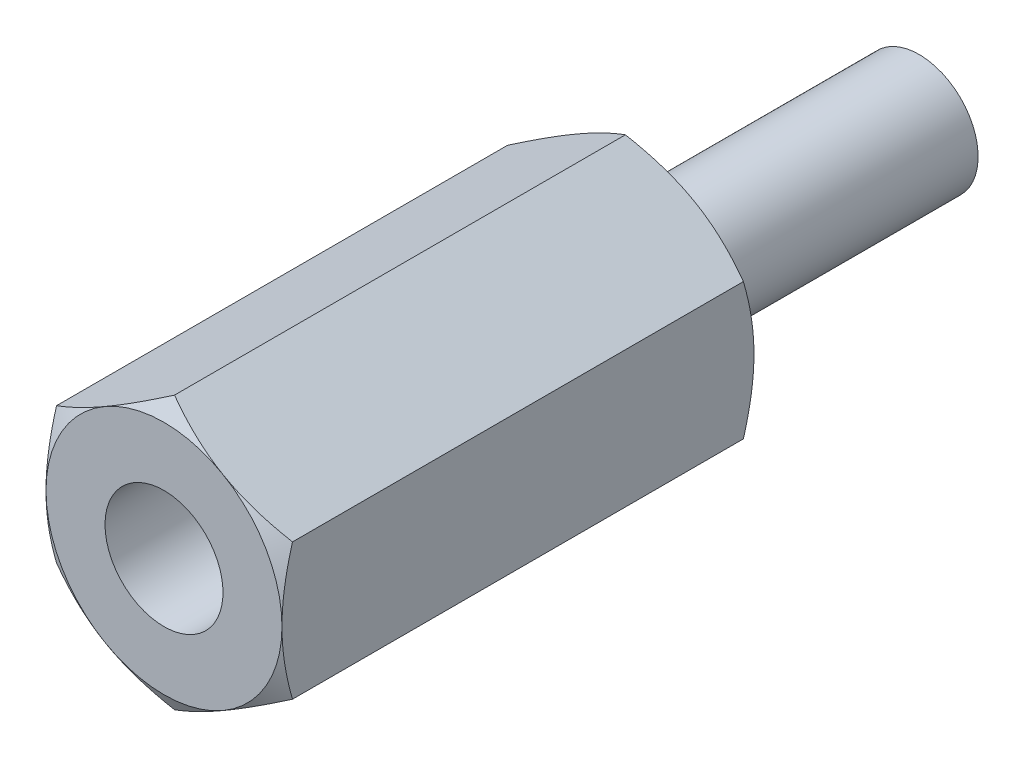
ISO-10303-21;
HEADER;
FILE_DESCRIPTION(('STEP AP214'),'2;1');
FILE_NAME('part.step','',(''),(''),'','','');
FILE_SCHEMA(('AUTOMOTIVE_DESIGN { 1 0 10303 214 1 1 1 1 }'));
ENDSEC;
DATA;
#1=APPLICATION_CONTEXT('core data for automotive mechanical design processes');
#2=APPLICATION_PROTOCOL_DEFINITION('international standard','automotive_design',2000,#1);
#3=PRODUCT_CONTEXT('',#1,'mechanical');
#4=PRODUCT('Part','Part','',(#3));
#5=PRODUCT_RELATED_PRODUCT_CATEGORY('part','',(#4));
#6=PRODUCT_DEFINITION_FORMATION('','',#4);
#7=PRODUCT_DEFINITION_CONTEXT('part definition',#1,'design');
#8=PRODUCT_DEFINITION('design','',#6,#7);
#9=PRODUCT_DEFINITION_SHAPE('','',#8);
#10=(LENGTH_UNIT() NAMED_UNIT(*) SI_UNIT(.MILLI.,.METRE.));
#11=(NAMED_UNIT(*) PLANE_ANGLE_UNIT() SI_UNIT($,.RADIAN.));
#12=(NAMED_UNIT(*) SI_UNIT($,.STERADIAN.) SOLID_ANGLE_UNIT());
#13=UNCERTAINTY_MEASURE_WITH_UNIT(LENGTH_MEASURE(1.E-05),#10,'distance_accuracy_value','');
#14=(GEOMETRIC_REPRESENTATION_CONTEXT(3) GLOBAL_UNCERTAINTY_ASSIGNED_CONTEXT((#13)) GLOBAL_UNIT_ASSIGNED_CONTEXT((#10,
#11,#12)) REPRESENTATION_CONTEXT('',''));
#15=CARTESIAN_POINT('',(0.,0.,0.));
#16=DIRECTION('',(0.,0.,1.));
#17=DIRECTION('',(1.,0.,0.));
#18=AXIS2_PLACEMENT_3D('',#15,#16,#17);
#19=CARTESIAN_POINT('',(0.,0.,-4.77536926035782));
#20=DIRECTION('',(0.,0.,1.));
#21=DIRECTION('',(1.,0.,0.));
#22=AXIS2_PLACEMENT_3D('',#19,#20,#21);
#23=CONICAL_SURFACE('',#22,2.88907185398557,1.04719755117262);
#24=CARTESIAN_POINT('',(-7.08110458969458E-08,2.88675134353334,-4.77670896439458));
#25=CARTESIAN_POINT('',(0.101767141185275,2.82799604409952,-4.81063129042307));
#26=CARTESIAN_POINT('',(0.204322575283856,2.76878564797065,-4.84171386801845));
#27=CARTESIAN_POINT('',(0.410337667627594,2.64984278719961,-4.89652772623953));
#28=CARTESIAN_POINT('',(0.51379013883194,2.59011447207015,-4.92029535741371));
#29=CARTESIAN_POINT('',(0.722074540919704,2.46986141428833,-4.95920267065775));
#30=CARTESIAN_POINT('',(0.826907880543953,2.40933585830341,-4.97433270862273));
#31=CARTESIAN_POINT('',(0.984944191016707,2.31809355223726,-4.98964323938749));
#32=CARTESIAN_POINT('',(1.03789142562392,2.28752445202925,-4.99351636188467));
#33=CARTESIAN_POINT('',(1.14389002708072,2.22632613083503,-4.99869890228769));
#34=CARTESIAN_POINT('',(1.19694141247179,2.1956968991439,-5.0000078124577));
#35=CARTESIAN_POINT('',(1.25,2.16506350946109,-5.00000000000294));
#36=B_SPLINE_CURVE_WITH_KNOTS('',3,(#24,#25,#26,#27,#28,#29,#30,#31,#32,#33,#34,#35),
.UNSPECIFIED.,.F.,.F.,(4,2,2,2,2,4),(0.,0.367018347334865,0.732182251596257,1.09775307775673,
1.28148755337713,1.46525840630775),.UNSPECIFIED.);
#37=CARTESIAN_POINT('',(-4.305442959148E-08,2.88675132109064,-4.77670902064944));
#38=VERTEX_POINT('',#37);
#39=CARTESIAN_POINT('',(1.24999999999943,2.16506350946011,-5.00000000000359));
#40=VERTEX_POINT('',#39);
#41=EDGE_CURVE('P0_E129',#38,#40,#36,.T.);
#42=ORIENTED_EDGE('',*,*,#41,.T.);
#43=CARTESIAN_POINT('',(0.,0.,-5.00000000000425));
#44=DIRECTION('',(0.,0.,1.));
#45=DIRECTION('',(1.,0.,0.));
#46=AXIS2_PLACEMENT_3D('',#43,#44,#45);
#47=CIRCLE('',#46,2.49999999999773);
#48=CARTESIAN_POINT('',(-1.24999999999943,2.16506350946011,-5.00000000000359));
#49=VERTEX_POINT('',#48);
#50=EDGE_CURVE('P0_E119',#49,#40,#47,.F.);
#51=ORIENTED_EDGE('',*,*,#50,.F.);
#52=CARTESIAN_POINT('',(-1.25,2.1650635094611,-5.00000000000293));
#53=CARTESIAN_POINT('',(-1.19694141878281,2.19569689560966,-5.00000781251171));
#54=CARTESIAN_POINT('',(-1.14389003964854,2.22632612363371,-4.99869890262452));
#55=CARTESIAN_POINT('',(-1.03789145062155,2.28752443754217,-4.99351636338333));
#56=CARTESIAN_POINT('',(-0.984944222187435,2.31809353413145,-4.9896432417626));
#57=CARTESIAN_POINT('',(-0.826907929954011,2.40933582999415,-4.97433271468945));
#58=CARTESIAN_POINT('',(-0.722074602461731,2.46986137984186,-4.95920268060034));
#59=CARTESIAN_POINT('',(-0.513790223309086,2.59011442221363,-4.92029537475209));
#60=CARTESIAN_POINT('',(-0.410337762906129,2.64984272807561,-4.89652774712257));
#61=CARTESIAN_POINT('',(-0.204322696634617,2.76878558204458,-4.84171390479733));
#62=CARTESIAN_POINT('',(-0.101767277824047,2.82799598070172,-4.81063133961675));
#63=CARTESIAN_POINT('',(-8.61088561993545E-08,2.88675129623316,-4.77670903500092));
#64=B_SPLINE_CURVE_WITH_KNOTS('',3,(#52,#53,#54,#55,#56,#57,#58,#59,#60,#61,#62,#63),
.UNSPECIFIED.,.F.,.F.,(4,2,2,2,2,4),(0.,0.183770831198168,0.367505285262938,0.733076069510794,
1.09823993088061,1.46525823411971),.UNSPECIFIED.);
#65=EDGE_CURVE('P0_E21',#49,#38,#64,.T.);
#66=ORIENTED_EDGE('',*,*,#65,.T.);
#67=EDGE_LOOP('',(#42,#51,#66));
#68=FACE_BOUND('',#67,.T.);
#69=ADVANCED_FACE('P0_F17',(#68),#23,.T.);
#70=CARTESIAN_POINT('',(0.,0.,-4.77536926035782));
#71=DIRECTION('',(0.,0.,1.));
#72=DIRECTION('',(1.,0.,0.));
#73=AXIS2_PLACEMENT_3D('',#70,#71,#72);
#74=CONICAL_SURFACE('',#73,2.88907185398557,1.04719755117262);
#75=CARTESIAN_POINT('',(0.,0.,-5.00000000000425));
#76=DIRECTION('',(0.,0.,1.));
#77=DIRECTION('',(1.,0.,0.));
#78=AXIS2_PLACEMENT_3D('',#75,#76,#77);
#79=CIRCLE('',#78,2.49999999999773);
#80=CARTESIAN_POINT('',(2.49999999999886,0.,-5.00000000000359));
#81=VERTEX_POINT('',#80);
#82=EDGE_CURVE('P0_E141',#40,#81,#79,.F.);
#83=ORIENTED_EDGE('',*,*,#82,.F.);
#84=CARTESIAN_POINT('',(1.25,2.16506350946109,-5.00000000000294));
#85=CARTESIAN_POINT('',(1.30305858726613,2.13443011982017,-5.00000781251527));
#86=CARTESIAN_POINT('',(1.35610997244676,2.10380088830525,-4.99869890232771));
#87=CARTESIAN_POINT('',(1.46210857352899,2.0426025674367,-4.99351636190913));
#88=CARTESIAN_POINT('',(1.515055807972,2.01203346737819,-4.98964323941175));
#89=CARTESIAN_POINT('',(1.67309211799855,1.92079116124262,-4.97433270891051));
#90=CARTESIAN_POINT('',(1.77792545718978,1.86026560464052,-4.95920267147099));
#91=CARTESIAN_POINT('',(1.98620985931024,1.74001254900827,-4.92029535730132));
#92=CARTESIAN_POINT('',(2.08966233098298,1.68028423663968,-4.896527724706));
#93=CARTESIAN_POINT('',(2.29567741958501,1.56134136977817,-4.8417138712966));
#94=CARTESIAN_POINT('',(2.3982328494534,1.5021309647368,-4.81063129998625));
#95=CARTESIAN_POINT('',(2.50000005206237,1.44337564291584,-4.77670898894384));
#96=B_SPLINE_CURVE_WITH_KNOTS('',3,(#84,#85,#86,#87,#88,#89,#90,#91,#92,#93,#94,#95),
.UNSPECIFIED.,.F.,.F.,(4,2,2,2,2,4),(0.,0.183770852142172,0.367505327130569,0.733076152714915,
1.09824005523158,1.46525840012142),.UNSPECIFIED.);
#97=CARTESIAN_POINT('',(2.50000002886377,1.44337565630955,-4.77670899667671));
#98=VERTEX_POINT('',#97);
#99=EDGE_CURVE('P0_E320',#40,#98,#96,.T.);
#100=ORIENTED_EDGE('',*,*,#99,.T.);
#101=CARTESIAN_POINT('',(2.5,1.44337557354446,-4.77670903500082));
#102=CARTESIAN_POINT('',(2.5,1.32586494248156,-4.81063133961667));
#103=CARTESIAN_POINT('',(2.5,1.20744414516726,-4.84171390479726));
#104=CARTESIAN_POINT('',(2.5,0.969558437229248,-4.89652774712252));
#105=CARTESIAN_POINT('',(2.5,0.850101825505269,-4.92029537475205));
#106=CARTESIAN_POINT('',(2.5,0.609595740761665,-4.95920268060032));
#107=CARTESIAN_POINT('',(2.5,0.488544641066212,-4.97433271468944));
#108=CARTESIAN_POINT('',(2.5,0.306060049340773,-4.9896432417626));
#109=CARTESIAN_POINT('',(2.5,0.244921856162199,-4.99351636338332));
#110=CARTESIAN_POINT('',(2.5,0.122525228345262,-4.99869890262452));
#111=CARTESIAN_POINT('',(2.5,0.0612667722971475,-5.00000781251171));
#112=CARTESIAN_POINT('',(2.5,0.,-5.00000000000293));
#113=B_SPLINE_CURVE_WITH_KNOTS('',3,(#101,#102,#103,#104,#105,#106,#107,#108,#109,#110,#111,
#112),.UNSPECIFIED.,.F.,.F.,(4,2,2,2,2,4),(0.,0.367018303239194,0.732182164609092,
1.09775294885704,1.28148740292185,1.46525823412006),.UNSPECIFIED.);
#114=EDGE_CURVE('P0_E326',#98,#81,#113,.T.);
#115=ORIENTED_EDGE('',*,*,#114,.T.);
#116=EDGE_LOOP('',(#83,#100,#115));
#117=FACE_BOUND('',#116,.T.);
#118=ADVANCED_FACE('P0_F312',(#117),#74,.T.);
#119=CARTESIAN_POINT('',(0.,0.,-4.77536926035782));
#120=DIRECTION('',(0.,0.,1.));
#121=DIRECTION('',(1.,0.,0.));
#122=AXIS2_PLACEMENT_3D('',#119,#120,#121);
#123=CONICAL_SURFACE('',#122,2.88907185398557,1.04719755117262);
#124=CARTESIAN_POINT('',(0.,0.,-5.00000000000425));
#125=DIRECTION('',(0.,0.,1.));
#126=DIRECTION('',(1.,0.,0.));
#127=AXIS2_PLACEMENT_3D('',#124,#125,#126);
#128=CIRCLE('',#127,2.49999999999773);
#129=CARTESIAN_POINT('',(1.24999999999943,-2.16506350946011,-5.00000000000359));
#130=VERTEX_POINT('',#129);
#131=EDGE_CURVE('P0_E143',#81,#130,#128,.F.);
#132=ORIENTED_EDGE('',*,*,#131,.F.);
#133=CARTESIAN_POINT('',(2.5,0.,-5.00000000000293));
#134=CARTESIAN_POINT('',(2.5,-0.0612667792805873,-5.00000781251526));
#135=CARTESIAN_POINT('',(2.5,-0.122525242309175,-4.99869890232776));
#136=CARTESIAN_POINT('',(2.5,-0.244921884043781,-4.9935163619094));
#137=CARTESIAN_POINT('',(2.5,-0.306060084159568,-4.98964323941217));
#138=CARTESIAN_POINT('',(2.5,-0.488544696427004,-4.97433270891154));
#139=CARTESIAN_POINT('',(2.5,-0.60959580962879,-4.95920267147263));
#140=CARTESIAN_POINT('',(2.5,-0.850101920888531,-4.92029535730445));
#141=CARTESIAN_POINT('',(2.5,-0.969558545623372,-4.89652772471002));
#142=CARTESIAN_POINT('',(2.5,-1.20744427934176,-4.84171387130261));
#143=CARTESIAN_POINT('',(2.5,-1.3258650894222,-4.81063129999337));
#144=CARTESIAN_POINT('',(2.5,-1.44337573306188,-4.77670898895211));
#145=B_SPLINE_CURVE_WITH_KNOTS('',3,(#133,#134,#135,#136,#137,#138,#139,#140,#141,#142,#143,
#144),.UNSPECIFIED.,.F.,.F.,(4,2,2,2,2,4),(0.,0.183770852138413,0.367505327123055,
0.733076152699981,1.09824005520926,1.46525840009163),.UNSPECIFIED.);
#146=CARTESIAN_POINT('',(2.5,-1.44337570629047,-4.77670899668035));
#147=VERTEX_POINT('',#146);
#148=EDGE_CURVE('P0_E289',#81,#147,#145,.T.);
#149=ORIENTED_EDGE('',*,*,#148,.T.);
#150=CARTESIAN_POINT('',(2.49999991386643,-1.44337572270331,-4.77670903500916));
#151=CARTESIAN_POINT('',(2.39823272215319,-1.50213103823362,-4.81063133962384));
#152=CARTESIAN_POINT('',(2.29567730334459,-1.56134143688962,-4.84171390480332));
#153=CARTESIAN_POINT('',(2.08966223707707,-1.68028429085629,-4.89652774712658));
#154=CARTESIAN_POINT('',(1.98620977667613,-1.7400125967171,-4.92029537475521));
#155=CARTESIAN_POINT('',(1.7779253975276,-1.8602656390865,-4.95920268060197));
#156=CARTESIAN_POINT('',(1.67309207003741,-1.920791188933,-4.97433271469048));
#157=CARTESIAN_POINT('',(1.51505577780717,-2.01203348479386,-4.98964324176302));
#158=CARTESIAN_POINT('',(1.46210854937413,-2.04260258138252,-4.99351636338359));
#159=CARTESIAN_POINT('',(1.3561099603493,-2.10380089528973,-4.99869890262458));
#160=CARTESIAN_POINT('',(1.30305858121611,-2.13443012331316,-5.00000781251171));
#161=CARTESIAN_POINT('',(1.25,-2.1650635094611,-5.00000000000293));
#162=B_SPLINE_CURVE_WITH_KNOTS('',3,(#150,#151,#152,#153,#154,#155,#156,#157,#158,#159,#160,
#161),.UNSPECIFIED.,.F.,.F.,(4,2,2,2,2,4),(0.,0.367018303231656,0.732182164594107,
1.09775294883457,1.2814874028956,1.46525823409002),.UNSPECIFIED.);
#163=EDGE_CURVE('P0_E281',#147,#130,#162,.T.);
#164=ORIENTED_EDGE('',*,*,#163,.T.);
#165=EDGE_LOOP('',(#132,#149,#164));
#166=FACE_BOUND('',#165,.T.);
#167=ADVANCED_FACE('P0_F308',(#166),#123,.T.);
#168=CARTESIAN_POINT('',(0.,0.,-4.77536926035782));
#169=DIRECTION('',(0.,0.,1.));
#170=DIRECTION('',(1.,0.,0.));
#171=AXIS2_PLACEMENT_3D('',#168,#169,#170);
#172=CONICAL_SURFACE('',#171,2.88907185398557,1.04719755117262);
#173=CARTESIAN_POINT('',(0.,0.,-5.00000000000425));
#174=DIRECTION('',(0.,0.,1.));
#175=DIRECTION('',(1.,0.,0.));
#176=AXIS2_PLACEMENT_3D('',#173,#174,#175);
#177=CIRCLE('',#176,2.49999999999773);
#178=CARTESIAN_POINT('',(-1.24999999999943,-2.16506350946011,-5.00000000000359));
#179=VERTEX_POINT('',#178);
#180=EDGE_CURVE('P0_E139',#130,#179,#177,.F.);
#181=ORIENTED_EDGE('',*,*,#180,.F.);
#182=CARTESIAN_POINT('',(1.25,-2.1650635094611,-5.00000000000293));
#183=CARTESIAN_POINT('',(1.19694141273445,-2.19569689910168,-5.00000781251526));
#184=CARTESIAN_POINT('',(1.1438900275544,-2.22632613061627,-4.99869890232773));
#185=CARTESIAN_POINT('',(1.03789142647331,-2.28752445148416,-4.99351636190927));
#186=CARTESIAN_POINT('',(0.984944192030882,-2.31809355154234,-4.98964323941197));
#187=CARTESIAN_POINT('',(0.826907882006037,-2.40933585767692,-4.97433270891106));
#188=CARTESIAN_POINT('',(0.722074542815924,-2.46986141427838,-4.95920267147186));
#189=CARTESIAN_POINT('',(0.513790140697656,-2.59011446990936,-4.92029535730298));
#190=CARTESIAN_POINT('',(0.410337669025995,-2.64984278227733,-4.89652772470814));
#191=CARTESIAN_POINT('',(0.204322580426101,-2.7687856491376,-4.8417138712998));
#192=CARTESIAN_POINT('',(0.101767150558775,-2.82799605417836,-4.81063129999004));
#193=CARTESIAN_POINT('',(-5.2049158781085E-08,-2.88675137599873,-4.77670898894825));
#194=B_SPLINE_CURVE_WITH_KNOTS('',3,(#182,#183,#184,#185,#186,#187,#188,#189,#190,#191,#192,
#193),.UNSPECIFIED.,.F.,.F.,(4,2,2,2,2,4),(0.,0.183770852140169,0.367505327126564,
0.733076152706955,1.09824005521969,1.46525840010554),.UNSPECIFIED.);
#195=CARTESIAN_POINT('',(-2.88578851821517E-08,-2.88675136260924,-4.77670899667867));
#196=VERTEX_POINT('',#195);
#197=EDGE_CURVE('P0_E279',#130,#196,#194,.T.);
#198=ORIENTED_EDGE('',*,*,#197,.T.);
#199=CARTESIAN_POINT('',(-8.61202042122576E-08,-2.8867512962266,-4.7767090350047));
#200=CARTESIAN_POINT('',(-0.1017672778345,-2.82799598069568,-4.81063133962001));
#201=CARTESIAN_POINT('',(-0.204322696644161,-2.76878558203907,-4.84171390480008));
#202=CARTESIAN_POINT('',(-0.41033776291384,-2.64984272807115,-4.89652774712441));
#203=CARTESIAN_POINT('',(-0.51379022331587,-2.59011442220971,-4.92029537475353));
#204=CARTESIAN_POINT('',(-0.722074602466628,-2.46986137983902,-4.95920268060109));
#205=CARTESIAN_POINT('',(-0.826907929957947,-2.40933582999187,-4.97433271468993));
#206=CARTESIAN_POINT('',(-0.98494422218991,-2.31809353413001,-4.9896432417628));
#207=CARTESIAN_POINT('',(-1.03789145062353,-2.28752443754102,-4.99351636338345));
#208=CARTESIAN_POINT('',(-1.14389003964953,-2.22632612363314,-4.99869890262455));
#209=CARTESIAN_POINT('',(-1.1969414187833,-2.19569689560937,-5.00000781251171));
#210=CARTESIAN_POINT('',(-1.25,-2.16506350946109,-5.00000000000294));
#211=B_SPLINE_CURVE_WITH_KNOTS('',3,(#199,#200,#201,#202,#203,#204,#205,#206,#207,#208,#209,
#210),.UNSPECIFIED.,.F.,.F.,(4,2,2,2,2,4),(0.,0.367018303235684,0.732182164602115,
1.09775294884658,1.28148740290963,1.46525823410607),.UNSPECIFIED.);
#212=EDGE_CURVE('P0_E286',#196,#179,#211,.T.);
#213=ORIENTED_EDGE('',*,*,#212,.T.);
#214=EDGE_LOOP('',(#181,#198,#213));
#215=FACE_BOUND('',#214,.T.);
#216=ADVANCED_FACE('P0_F287',(#215),#172,.T.);
#217=CARTESIAN_POINT('',(0.,0.,-4.77536926035782));
#218=DIRECTION('',(0.,0.,1.));
#219=DIRECTION('',(1.,0.,0.));
#220=AXIS2_PLACEMENT_3D('',#217,#218,#219);
#221=CONICAL_SURFACE('',#220,2.88907185398557,1.04719755117262);
#222=CARTESIAN_POINT('',(-2.50000003330063,1.44337561043705,-4.77670896438965));
#223=CARTESIAN_POINT('',(-2.39823284539096,1.50213095158687,-4.81063129042238));
#224=CARTESIAN_POINT('',(-2.29567742112828,1.56134136475008,-4.84171386801935));
#225=CARTESIAN_POINT('',(-2.08966233593221,1.68028423789843,-4.89652772624128));
#226=CARTESIAN_POINT('',(-1.98620986210266,1.74001254848003,-4.92029535741474));
#227=CARTESIAN_POINT('',(-1.7779254581377,1.86026560300807,-4.95920267065802));
#228=CARTESIAN_POINT('',(-1.67309211926522,1.9207911602936,-4.97433270862297));
#229=CARTESIAN_POINT('',(-1.51505580907665,2.01203346684984,-4.98964323938761));
#230=CARTESIAN_POINT('',(-1.46210857442235,2.04260256697564,-4.99351636188475));
#231=CARTESIAN_POINT('',(-1.35610997287134,2.1038008880054,-4.99869890228769));
#232=CARTESIAN_POINT('',(-1.30305858743315,2.13443011961429,-5.00000781245768));
#233=CARTESIAN_POINT('',(-1.25,2.1650635094611,-5.00000000000293));
#234=B_SPLINE_CURVE_WITH_KNOTS('',3,(#222,#223,#224,#225,#226,#227,#228,#229,#230,#231,#232,
#233),.UNSPECIFIED.,.F.,.F.,(4,2,2,2,2,4),(0.,0.367018347333249,0.732182251592837,
1.09775307775113,1.28148755337054,1.46525840630021),.UNSPECIFIED.);
#235=CARTESIAN_POINT('',(-2.5,1.4433756232491,-4.77670902065233));
#236=VERTEX_POINT('',#235);
#237=EDGE_CURVE('P0_E109',#236,#49,#234,.T.);
#238=ORIENTED_EDGE('',*,*,#237,.T.);
#239=CARTESIAN_POINT('',(0.,0.,-5.00000000000425));
#240=DIRECTION('',(0.,0.,1.));
#241=DIRECTION('',(1.,0.,0.));
#242=AXIS2_PLACEMENT_3D('',#239,#240,#241);
#243=CIRCLE('',#242,2.49999999999773);
#244=CARTESIAN_POINT('',(-2.49999999999886,0.,-5.00000000000359));
#245=VERTEX_POINT('',#244);
#246=EDGE_CURVE('P0_E113',#245,#49,#243,.F.);
#247=ORIENTED_EDGE('',*,*,#246,.F.);
#248=CARTESIAN_POINT('',(-2.5,0.,-5.00000000000293));
#249=CARTESIAN_POINT('',(-2.5,0.061266772296258,-5.00000781251171));
#250=CARTESIAN_POINT('',(-2.5,0.122525228343483,-4.99869890262456));
#251=CARTESIAN_POINT('',(-2.5,0.244921856158648,-4.99351636338351));
#252=CARTESIAN_POINT('',(-2.5,0.306060049336338,-4.9896432417629));
#253=CARTESIAN_POINT('',(-2.5,0.48854464105916,-4.97433271469017));
#254=CARTESIAN_POINT('',(-2.5,0.609595740752892,-4.95920268060148));
#255=CARTESIAN_POINT('',(-2.5,0.850101825493118,-4.92029537475428));
#256=CARTESIAN_POINT('',(-2.5,0.96955843721544,-4.89652774712538));
#257=CARTESIAN_POINT('',(-2.5,1.20744414515016,-4.84171390480152));
#258=CARTESIAN_POINT('',(-2.5,1.32586494246284,-4.81063133962172));
#259=CARTESIAN_POINT('',(-2.5,1.44337557352414,-4.77670903500669));
#260=B_SPLINE_CURVE_WITH_KNOTS('',3,(#248,#249,#250,#251,#252,#253,#254,#255,#256,#257,#258,
#259),.UNSPECIFIED.,.F.,.F.,(4,2,2,2,2,4),(0.,0.183770831195545,0.367505285257694,
0.733076069500374,1.09823993086503,1.46525823409892),.UNSPECIFIED.);
#261=EDGE_CURVE('P0_E115',#245,#236,#260,.T.);
#262=ORIENTED_EDGE('',*,*,#261,.T.);
#263=EDGE_LOOP('',(#238,#247,#262));
#264=FACE_BOUND('',#263,.T.);
#265=ADVANCED_FACE('P0_F111',(#264),#221,.T.);
#266=CARTESIAN_POINT('',(0.,0.,-5.));
#267=DIRECTION('',(0.,0.,-1.));
#268=DIRECTION('',(-1.,0.,0.));
#269=AXIS2_PLACEMENT_3D('',#266,#267,#268);
#270=PLANE('',#269);
#271=CARTESIAN_POINT('',(0.,0.,-5.00000000000425));
#272=DIRECTION('',(0.,0.,1.));
#273=DIRECTION('',(1.,0.,0.));
#274=AXIS2_PLACEMENT_3D('',#271,#272,#273);
#275=CIRCLE('',#274,2.49999999999773);
#276=EDGE_CURVE('P0_E137',#245,#179,#275,.T.);
#277=ORIENTED_EDGE('',*,*,#276,.F.);
#278=ORIENTED_EDGE('',*,*,#246,.T.);
#279=ORIENTED_EDGE('',*,*,#50,.T.);
#280=ORIENTED_EDGE('',*,*,#82,.T.);
#281=ORIENTED_EDGE('',*,*,#131,.T.);
#282=ORIENTED_EDGE('',*,*,#180,.T.);
#283=EDGE_LOOP('',(#277,#278,#279,#280,#281,#282));
#284=FACE_BOUND('',#283,.T.);
#285=ADVANCED_FACE('P0_F132',(#284),#270,.T.);
#286=CARTESIAN_POINT('',(0.,0.,-4.77536926035782));
#287=DIRECTION('',(0.,0.,1.));
#288=DIRECTION('',(1.,0.,0.));
#289=AXIS2_PLACEMENT_3D('',#286,#287,#288);
#290=CONICAL_SURFACE('',#289,2.88907185398557,1.04719755117262);
#291=CARTESIAN_POINT('',(-2.5,0.,-5.00000000000293));
#292=CARTESIAN_POINT('',(-2.5,-0.0612667766499199,-5.00000781251393));
#293=CARTESIAN_POINT('',(-2.5,-0.122525237048958,-4.99869890243955));
#294=CARTESIAN_POINT('',(-2.5,-0.244921873540768,-4.99351636246463));
#295=CARTESIAN_POINT('',(-2.5,-0.306060071043301,-4.98964324029758));
#296=CARTESIAN_POINT('',(-2.5,-0.488544675572551,-4.97433271108808));
#297=CARTESIAN_POINT('',(-2.5,-0.609595783686492,-4.95920267491104));
#298=CARTESIAN_POINT('',(-2.5,-0.850101884957583,-4.92029536387697));
#299=CARTESIAN_POINT('',(-2.5,-0.969558504791223,-4.89652773315283));
#300=CARTESIAN_POINT('',(-2.5,-1.20744422879812,-4.84171388392007));
#301=CARTESIAN_POINT('',(-2.5,-1.32586503406955,-4.81063131491949));
#302=CARTESIAN_POINT('',(-2.5,-1.44337567297155,-4.77670900629869));
#303=B_SPLINE_CURVE_WITH_KNOTS('',3,(#291,#292,#293,#294,#295,#296,#297,#298,#299,#300,#301,
#302),.UNSPECIFIED.,.F.,.F.,(4,2,2,2,2,4),(0.,0.183770844250223,0.36750531135435,
0.733076121362618,1.09824000837466,1.46525833757001),.UNSPECIFIED.);
#304=CARTESIAN_POINT('',(-2.49999999999891,-1.44337567297343,-4.77670900629869));
#305=VERTEX_POINT('',#304);
#306=EDGE_CURVE('P0_E236',#245,#305,#303,.T.);
#307=ORIENTED_EDGE('',*,*,#306,.F.);
#308=ORIENTED_EDGE('',*,*,#276,.T.);
#309=CARTESIAN_POINT('',(-2.49999999999782,-1.44337567297532,-4.77670900629869));
#310=CARTESIAN_POINT('',(-2.39823280149375,-1.50213099242631,-4.81063131491949));
#311=CARTESIAN_POINT('',(-2.29567737579209,-1.56134139506203,-4.84171388392007));
#312=CARTESIAN_POINT('',(-2.08966229560446,-1.68028425706548,-4.89652773315283));
#313=CARTESIAN_POINT('',(-1.98620982817831,-1.7400125669823,-4.92029536387698));
#314=CARTESIAN_POINT('',(-1.77792543471239,-1.86026561761785,-4.95920267491104));
#315=CARTESIAN_POINT('',(-1.67309209992946,-1.92079117167482,-4.97433271108808));
#316=CARTESIAN_POINT('',(-1.51505579660757,-2.01203347393944,-4.98964324029758));
#317=CARTESIAN_POINT('',(-1.46210856442878,-2.04260257269071,-4.99351636246463));
#318=CARTESIAN_POINT('',(-1.35610996788911,-2.10380089093661,-4.99869890243955));
#319=CARTESIAN_POINT('',(-1.30305858498682,-2.13443012113613,-5.00000781251393));
#320=CARTESIAN_POINT('',(-1.25,-2.16506350946109,-5.00000000000294));
#321=B_SPLINE_CURVE_WITH_KNOTS('',3,(#309,#310,#311,#312,#313,#314,#315,#316,#317,#318,#319,
#320),.UNSPECIFIED.,.F.,.F.,(4,2,2,2,2,4),(0.,0.367018329195354,0.732182216207401,
1.09775302621567,1.2814874933198,1.46525833757002),.UNSPECIFIED.);
#322=EDGE_CURVE('P0_E256',#305,#179,#321,.T.);
#323=ORIENTED_EDGE('',*,*,#322,.F.);
#324=EDGE_LOOP('',(#307,#308,#323));
#325=FACE_BOUND('',#324,.T.);
#326=ADVANCED_FACE('P0_F250',(#325),#290,.T.);
#327=CARTESIAN_POINT('',(-2.5,-1.44337567297406,0.));
#328=DIRECTION('',(-0.5,-0.866025403784439,0.));
#329=DIRECTION('',(0.866025403784439,-0.5,0.));
#330=AXIS2_PLACEMENT_3D('',#327,#328,#329);
#331=PLANE('',#330);
#332=CARTESIAN_POINT('',(-1.25,-2.16506350946109,5.00000000000294));
#333=CARTESIAN_POINT('',(-1.30305858498681,-2.13443012113613,5.00000781251393));
#334=CARTESIAN_POINT('',(-1.3561099678891,-2.10380089093661,4.99869890243955));
#335=CARTESIAN_POINT('',(-1.46210856442878,-2.04260257269071,4.99351636246463));
#336=CARTESIAN_POINT('',(-1.51505579660757,-2.01203347393944,4.98964324029758));
#337=CARTESIAN_POINT('',(-1.67309209992946,-1.92079117167482,4.97433271108808));
#338=CARTESIAN_POINT('',(-1.77792543471239,-1.86026561761785,4.95920267491104));
#339=CARTESIAN_POINT('',(-1.9862098281783,-1.7400125669823,4.92029536387698));
#340=CARTESIAN_POINT('',(-2.08966229560446,-1.68028425706548,4.89652773315283));
#341=CARTESIAN_POINT('',(-2.29567737579208,-1.56134139506203,4.84171388392007));
#342=CARTESIAN_POINT('',(-2.39823280149375,-1.50213099242632,4.8106313149195));
#343=CARTESIAN_POINT('',(-2.49999999999782,-1.44337567297532,4.77670900629869));
#344=B_SPLINE_CURVE_WITH_KNOTS('',3,(#332,#333,#334,#335,#336,#337,#338,#339,#340,#341,#342,
#343),.UNSPECIFIED.,.F.,.F.,(4,2,2,2,2,4),(0.,0.183770844250225,0.367505311354353,
0.733076121362622,1.09824000837467,1.46525833757002),.UNSPECIFIED.);
#345=CARTESIAN_POINT('',(-1.24999999999943,-2.16506350946011,5.00000000000359));
#346=VERTEX_POINT('',#345);
#347=CARTESIAN_POINT('',(-2.49999999999891,-1.44337567297469,4.77670900629833));
#348=VERTEX_POINT('',#347);
#349=EDGE_CURVE('P0_E244',#346,#348,#344,.T.);
#350=ORIENTED_EDGE('',*,*,#349,.T.);
#351=DIRECTION('',(0.,0.,1.));
#352=VECTOR('',#351,1.);
#353=CARTESIAN_POINT('',(-2.5,-1.44337567297406,0.));
#354=LINE('',#353,#352);
#355=EDGE_CURVE('P0_E243',#305,#348,#354,.T.);
#356=ORIENTED_EDGE('',*,*,#355,.F.);
#357=ORIENTED_EDGE('',*,*,#322,.T.);
#358=ORIENTED_EDGE('',*,*,#212,.F.);
#359=DIRECTION('',(0.,0.,1.));
#360=VECTOR('',#359,1.);
#361=CARTESIAN_POINT('',(0.,-2.88675134594813,0.));
#362=LINE('',#361,#360);
#363=CARTESIAN_POINT('',(0.,-2.88675134594687,4.77670900629869));
#364=VERTEX_POINT('',#363);
#365=EDGE_CURVE('P0_E283',#364,#196,#362,.F.);
#366=ORIENTED_EDGE('',*,*,#365,.F.);
#367=CARTESIAN_POINT('',(-2.17383223654998E-12,-2.88675134594687,4.77670900629869));
#368=CARTESIAN_POINT('',(-0.101767198506242,-2.82799602649587,4.8106313149195));
#369=CARTESIAN_POINT('',(-0.204322624207912,-2.76878562386016,4.84171388392007));
#370=CARTESIAN_POINT('',(-0.410337704395539,-2.64984276185671,4.89652773315283));
#371=CARTESIAN_POINT('',(-0.513790171821691,-2.59011445193989,4.92029536387698));
#372=CARTESIAN_POINT('',(-0.72207456528761,-2.46986140130434,4.95920267491104));
#373=CARTESIAN_POINT('',(-0.826907900070539,-2.40933584724737,4.97433271108808));
#374=CARTESIAN_POINT('',(-0.984944203392427,-2.31809354498275,4.98964324029758));
#375=CARTESIAN_POINT('',(-1.03789143557121,-2.28752444623148,4.99351636246463));
#376=CARTESIAN_POINT('',(-1.14389003211089,-2.22632612798557,4.99869890243955));
#377=CARTESIAN_POINT('',(-1.19694141501318,-2.19569689778605,5.00000781251393));
#378=CARTESIAN_POINT('',(-1.25,-2.16506350946109,5.00000000000294));
#379=B_SPLINE_CURVE_WITH_KNOTS('',3,(#367,#368,#369,#370,#371,#372,#373,#374,#375,#376,#377,
#378),.UNSPECIFIED.,.F.,.F.,(4,2,2,2,2,4),(0.,0.367018329195353,0.732182216207398,
1.09775302621567,1.28148749331979,1.46525833757002),.UNSPECIFIED.);
#380=EDGE_CURVE('P0_E263',#364,#346,#379,.T.);
#381=ORIENTED_EDGE('',*,*,#380,.T.);
#382=EDGE_LOOP('',(#350,#356,#357,#358,#366,#381));
#383=FACE_BOUND('',#382,.T.);
#384=ADVANCED_FACE('P0_F230',(#383),#331,.T.);
#385=CARTESIAN_POINT('',(-2.5,1.44337567297406,0.));
#386=DIRECTION('',(-1.,0.,0.));
#387=DIRECTION('',(0.,0.,1.));
#388=AXIS2_PLACEMENT_3D('',#385,#386,#387);
#389=PLANE('',#388);
#390=CARTESIAN_POINT('',(-2.5,0.,5.00000000000293));
#391=CARTESIAN_POINT('',(-2.5,0.06126677664992,5.00000781251393));
#392=CARTESIAN_POINT('',(-2.5,0.122525237048958,4.99869890243955));
#393=CARTESIAN_POINT('',(-2.5,0.244921873540768,4.99351636246463));
#394=CARTESIAN_POINT('',(-2.5,0.306060071043301,4.98964324029758));
#395=CARTESIAN_POINT('',(-2.5,0.488544675572552,4.97433271108808));
#396=CARTESIAN_POINT('',(-2.5,0.609595783686493,4.95920267491103));
#397=CARTESIAN_POINT('',(-2.5,0.850101884957585,4.92029536387698));
#398=CARTESIAN_POINT('',(-2.5,0.969558504791224,4.89652773315283));
#399=CARTESIAN_POINT('',(-2.5,1.20744422879812,4.84171388392007));
#400=CARTESIAN_POINT('',(-2.5,1.32586503406955,4.81063131491949));
#401=CARTESIAN_POINT('',(-2.5,1.44337567297155,4.77670900629869));
#402=B_SPLINE_CURVE_WITH_KNOTS('',3,(#390,#391,#392,#393,#394,#395,#396,#397,#398,#399,#400,
#401),.UNSPECIFIED.,.F.,.F.,(4,2,2,2,2,4),(0.,0.183770844250224,0.367505311354351,
0.733076121362619,1.09824000837466,1.46525833757002),.UNSPECIFIED.);
#403=CARTESIAN_POINT('',(-2.49999999999886,0.,5.00000000000359));
#404=VERTEX_POINT('',#403);
#405=CARTESIAN_POINT('',(-2.5,1.44337567297281,4.77670900629833));
#406=VERTEX_POINT('',#405);
#407=EDGE_CURVE('P0_E208',#404,#406,#402,.T.);
#408=ORIENTED_EDGE('',*,*,#407,.T.);
#409=DIRECTION('',(0.,0.,1.));
#410=VECTOR('',#409,1.);
#411=CARTESIAN_POINT('',(-2.5,1.44337567297406,0.));
#412=LINE('',#411,#410);
#413=EDGE_CURVE('P0_E189',#236,#406,#412,.T.);
#414=ORIENTED_EDGE('',*,*,#413,.F.);
#415=ORIENTED_EDGE('',*,*,#261,.F.);
#416=ORIENTED_EDGE('',*,*,#306,.T.);
#417=ORIENTED_EDGE('',*,*,#355,.T.);
#418=CARTESIAN_POINT('',(-2.5,-1.44337567297155,4.77670900629869));
#419=CARTESIAN_POINT('',(-2.5,-1.32586503406955,4.81063131491949));
#420=CARTESIAN_POINT('',(-2.5,-1.20744422879812,4.84171388392007));
#421=CARTESIAN_POINT('',(-2.5,-0.969558504791224,4.89652773315283));
#422=CARTESIAN_POINT('',(-2.5,-0.850101884957584,4.92029536387698));
#423=CARTESIAN_POINT('',(-2.5,-0.609595783686492,4.95920267491103));
#424=CARTESIAN_POINT('',(-2.5,-0.488544675572552,4.97433271108808));
#425=CARTESIAN_POINT('',(-2.5,-0.306060071043302,4.98964324029758));
#426=CARTESIAN_POINT('',(-2.5,-0.244921873540769,4.99351636246463));
#427=CARTESIAN_POINT('',(-2.5,-0.122525237048959,4.99869890243955));
#428=CARTESIAN_POINT('',(-2.5,-0.0612667766499209,5.00000781251393));
#429=CARTESIAN_POINT('',(-2.5,0.,5.00000000000293));
#430=B_SPLINE_CURVE_WITH_KNOTS('',3,(#418,#419,#420,#421,#422,#423,#424,#425,#426,#427,#428,
#429),.UNSPECIFIED.,.F.,.F.,(4,2,2,2,2,4),(0.,0.367018329195352,0.732182216207396,
1.09775302621566,1.28148749331979,1.46525833757001),.UNSPECIFIED.);
#431=EDGE_CURVE('P0_E215',#348,#404,#430,.T.);
#432=ORIENTED_EDGE('',*,*,#431,.T.);
#433=EDGE_LOOP('',(#408,#414,#415,#416,#417,#432));
#434=FACE_BOUND('',#433,.T.);
#435=ADVANCED_FACE('P0_F226',(#434),#389,.T.);
#436=CARTESIAN_POINT('',(0.,-2.88675134594813,0.));
#437=DIRECTION('',(0.5,-0.866025403784439,0.));
#438=DIRECTION('',(0.866025403784439,0.5,0.));
#439=AXIS2_PLACEMENT_3D('',#436,#437,#438);
#440=PLANE('',#439);
#441=CARTESIAN_POINT('',(1.25,-2.1650635094611,5.00000000000293));
#442=CARTESIAN_POINT('',(1.19694141501318,-2.19569689778606,5.00000781251393));
#443=CARTESIAN_POINT('',(1.14389003211089,-2.22632612798558,4.99869890243955));
#444=CARTESIAN_POINT('',(1.03789143557121,-2.28752444623148,4.99351636246463));
#445=CARTESIAN_POINT('',(0.984944203392431,-2.31809354498275,4.98964324029758));
#446=CARTESIAN_POINT('',(0.826907900070543,-2.40933584724737,4.97433271108808));
#447=CARTESIAN_POINT('',(0.722074565287614,-2.46986140130434,4.95920267491103));
#448=CARTESIAN_POINT('',(0.513790171821695,-2.59011445193989,4.92029536387697));
#449=CARTESIAN_POINT('',(0.410337704395543,-2.64984276185671,4.89652773315283));
#450=CARTESIAN_POINT('',(0.204322624207916,-2.76878562386016,4.84171388392007));
#451=CARTESIAN_POINT('',(0.101767198506247,-2.82799602649587,4.81063131491949));
#452=CARTESIAN_POINT('',(2.1789648315577E-12,-2.88675134594687,4.77670900629869));
#453=B_SPLINE_CURVE_WITH_KNOTS('',3,(#441,#442,#443,#444,#445,#446,#447,#448,#449,#450,#451,
#452),.UNSPECIFIED.,.F.,.F.,(4,2,2,2,2,4),(0.,0.183770844250224,0.36750531135435,
0.733076121362618,1.09824000837466,1.46525833757002),.UNSPECIFIED.);
#454=CARTESIAN_POINT('',(1.24999999999943,-2.16506350946011,5.00000000000359));
#455=VERTEX_POINT('',#454);
#456=EDGE_CURVE('P0_E190',#455,#364,#453,.T.);
#457=ORIENTED_EDGE('',*,*,#456,.T.);
#458=ORIENTED_EDGE('',*,*,#365,.T.);
#459=ORIENTED_EDGE('',*,*,#197,.F.);
#460=ORIENTED_EDGE('',*,*,#163,.F.);
#461=DIRECTION('',(0.,0.,-1.));
#462=VECTOR('',#461,1.);
#463=CARTESIAN_POINT('',(2.5,-1.44337567297406,0.));
#464=LINE('',#463,#462);
#465=CARTESIAN_POINT('',(2.49999999999891,-1.44337567297343,4.77670900629869));
#466=VERTEX_POINT('',#465);
#467=EDGE_CURVE('P0_E359',#466,#147,#464,.T.);
#468=ORIENTED_EDGE('',*,*,#467,.F.);
#469=CARTESIAN_POINT('',(2.49999999999783,-1.44337567297532,4.77670900629869));
#470=CARTESIAN_POINT('',(2.39823280149376,-1.50213099242632,4.81063131491949));
#471=CARTESIAN_POINT('',(2.29567737579209,-1.56134139506204,4.84171388392006));
#472=CARTESIAN_POINT('',(2.08966229560446,-1.68028425706548,4.89652773315283));
#473=CARTESIAN_POINT('',(1.98620982817831,-1.7400125669823,4.92029536387697));
#474=CARTESIAN_POINT('',(1.77792543471239,-1.86026561761785,4.95920267491103));
#475=CARTESIAN_POINT('',(1.67309209992946,-1.92079117167482,4.97433271108808));
#476=CARTESIAN_POINT('',(1.51505579660757,-2.01203347393945,4.98964324029758));
#477=CARTESIAN_POINT('',(1.46210856442879,-2.04260257269071,4.99351636246463));
#478=CARTESIAN_POINT('',(1.35610996788911,-2.10380089093662,4.99869890243955));
#479=CARTESIAN_POINT('',(1.30305858498682,-2.13443012113614,5.00000781251393));
#480=CARTESIAN_POINT('',(1.25,-2.1650635094611,5.00000000000293));
#481=B_SPLINE_CURVE_WITH_KNOTS('',3,(#469,#470,#471,#472,#473,#474,#475,#476,#477,#478,#479,
#480),.UNSPECIFIED.,.F.,.F.,(4,2,2,2,2,4),(0.,0.367018329195354,0.7321822162074,
1.09775302621567,1.2814874933198,1.46525833757002),.UNSPECIFIED.);
#482=EDGE_CURVE('P0_E214',#466,#455,#481,.T.);
#483=ORIENTED_EDGE('',*,*,#482,.T.);
#484=EDGE_LOOP('',(#457,#458,#459,#460,#468,#483));
#485=FACE_BOUND('',#484,.T.);
#486=ADVANCED_FACE('P0_F166',(#485),#440,.T.);
#487=CARTESIAN_POINT('',(0.,2.88675134594813,0.));
#488=DIRECTION('',(-0.5,0.866025403784439,0.));
#489=DIRECTION('',(-0.866025403784439,-0.5,0.));
#490=AXIS2_PLACEMENT_3D('',#487,#488,#489);
#491=PLANE('',#490);
#492=CARTESIAN_POINT('',(-1.25,2.1650635094611,5.00000000000293));
#493=CARTESIAN_POINT('',(-1.19694141549902,2.19569689750556,5.00000781251364));
#494=CARTESIAN_POINT('',(-1.14389003308236,2.2263261274247,4.99869890246339));
#495=CARTESIAN_POINT('',(-1.03789143751094,2.28752444511158,4.99351636258303));
#496=CARTESIAN_POINT('',(-0.984944205814779,2.31809354358421,4.98964324048639));
#497=CARTESIAN_POINT('',(-0.826907903922001,2.40933584502373,4.97433271155223));
#498=CARTESIAN_POINT('',(-0.722074570078709,2.4698613985382,4.95920267564429));
#499=CARTESIAN_POINT('',(-0.513790178457522,2.59011444810869,4.92029536527859));
#500=CARTESIAN_POINT('',(-0.410337711936538,2.64984275750292,4.89652773495328));
#501=CARTESIAN_POINT('',(-0.204322633542455,2.76878561847086,4.84171388661078));
#502=CARTESIAN_POINT('',(-0.101767208728929,2.82799602059381,4.81063131810254));
#503=CARTESIAN_POINT('',(-1.10998281282107E-08,2.88675133953964,4.77670900999791));
#504=B_SPLINE_CURVE_WITH_KNOTS('',3,(#492,#493,#494,#495,#496,#497,#498,#499,#500,#501,#502,
#503),.UNSPECIFIED.,.F.,.F.,(4,2,2,2,2,4),(0.,0.183770842568041,0.367505307991622,
0.733076114679823,1.09823999838703,1.46525832423708),.UNSPECIFIED.);
#505=CARTESIAN_POINT('',(-1.24999999999943,2.16506350946011,5.00000000000359));
#506=VERTEX_POINT('',#505);
#507=CARTESIAN_POINT('',(-5.54991571131984E-09,2.88675134274388,4.77670900814794));
#508=VERTEX_POINT('',#507);
#509=EDGE_CURVE('P0_E174',#506,#508,#504,.T.);
#510=ORIENTED_EDGE('',*,*,#509,.T.);
#511=DIRECTION('',(0.,0.,1.));
#512=VECTOR('',#511,1.);
#513=CARTESIAN_POINT('',(0.,2.88675134594813,0.));
#514=LINE('',#513,#512);
#515=EDGE_CURVE('P0_E125',#38,#508,#514,.T.);
#516=ORIENTED_EDGE('',*,*,#515,.F.);
#517=ORIENTED_EDGE('',*,*,#65,.F.);
#518=ORIENTED_EDGE('',*,*,#237,.F.);
#519=ORIENTED_EDGE('',*,*,#413,.T.);
#520=CARTESIAN_POINT('',(-2.49999999999783,1.44337567297532,4.77670900629869));
#521=CARTESIAN_POINT('',(-2.39823280149376,1.50213099242632,4.81063131491949));
#522=CARTESIAN_POINT('',(-2.29567737579209,1.56134139506204,4.84171388392006));
#523=CARTESIAN_POINT('',(-2.08966229560446,1.68028425706548,4.89652773315283));
#524=CARTESIAN_POINT('',(-1.98620982817831,1.7400125669823,4.92029536387697));
#525=CARTESIAN_POINT('',(-1.77792543471239,1.86026561761785,4.95920267491103));
#526=CARTESIAN_POINT('',(-1.67309209992946,1.92079117167482,4.97433271108808));
#527=CARTESIAN_POINT('',(-1.51505579660757,2.01203347393945,4.98964324029758));
#528=CARTESIAN_POINT('',(-1.46210856442879,2.04260257269071,4.99351636246463));
#529=CARTESIAN_POINT('',(-1.35610996788911,2.10380089093662,4.99869890243955));
#530=CARTESIAN_POINT('',(-1.30305858498682,2.13443012113614,5.00000781251393));
#531=CARTESIAN_POINT('',(-1.25,2.1650635094611,5.00000000000293));
#532=B_SPLINE_CURVE_WITH_KNOTS('',3,(#520,#521,#522,#523,#524,#525,#526,#527,#528,#529,#530,
#531),.UNSPECIFIED.,.F.,.F.,(4,2,2,2,2,4),(0.,0.367018329195354,0.7321822162074,
1.09775302621567,1.2814874933198,1.46525833757002),.UNSPECIFIED.);
#533=EDGE_CURVE('P0_E182',#406,#506,#532,.T.);
#534=ORIENTED_EDGE('',*,*,#533,.T.);
#535=EDGE_LOOP('',(#510,#516,#517,#518,#519,#534));
#536=FACE_BOUND('',#535,.T.);
#537=ADVANCED_FACE('P0_F123',(#536),#491,.T.);
#538=CARTESIAN_POINT('',(2.5,-1.44337567297406,0.));
#539=DIRECTION('',(1.,0.,0.));
#540=DIRECTION('',(0.,0.,-1.));
#541=AXIS2_PLACEMENT_3D('',#538,#539,#540);
#542=PLANE('',#541);
#543=CARTESIAN_POINT('',(2.5,0.,5.00000000000293));
#544=CARTESIAN_POINT('',(2.5,-0.0612667766499201,5.00000781251393));
#545=CARTESIAN_POINT('',(2.5,-0.122525237048958,4.99869890243955));
#546=CARTESIAN_POINT('',(2.5,-0.244921873540768,4.99351636246463));
#547=CARTESIAN_POINT('',(2.5,-0.306060071043301,4.98964324029758));
#548=CARTESIAN_POINT('',(2.5,-0.488544675572552,4.97433271108808));
#549=CARTESIAN_POINT('',(2.5,-0.609595783686492,4.95920267491103));
#550=CARTESIAN_POINT('',(2.5,-0.850101884957584,4.92029536387698));
#551=CARTESIAN_POINT('',(2.5,-0.969558504791224,4.89652773315283));
#552=CARTESIAN_POINT('',(2.5,-1.20744422879812,4.84171388392007));
#553=CARTESIAN_POINT('',(2.5,-1.32586503406955,4.81063131491949));
#554=CARTESIAN_POINT('',(2.5,-1.44337567297155,4.77670900629869));
#555=B_SPLINE_CURVE_WITH_KNOTS('',3,(#543,#544,#545,#546,#547,#548,#549,#550,#551,#552,#553,
#554),.UNSPECIFIED.,.F.,.F.,(4,2,2,2,2,4),(0.,0.183770844250224,0.367505311354351,
0.733076121362618,1.09824000837466,1.46525833757002),.UNSPECIFIED.);
#556=CARTESIAN_POINT('',(2.49999999999886,0.,5.00000000000359));
#557=VERTEX_POINT('',#556);
#558=EDGE_CURVE('P0_E354',#557,#466,#555,.T.);
#559=ORIENTED_EDGE('',*,*,#558,.T.);
#560=ORIENTED_EDGE('',*,*,#467,.T.);
#561=ORIENTED_EDGE('',*,*,#148,.F.);
#562=ORIENTED_EDGE('',*,*,#114,.F.);
#563=DIRECTION('',(0.,0.,1.));
#564=VECTOR('',#563,1.);
#565=CARTESIAN_POINT('',(2.5,1.44337567297406,0.));
#566=LINE('',#565,#564);
#567=CARTESIAN_POINT('',(2.5,1.4433756665657,4.7767090081479));
#568=VERTEX_POINT('',#567);
#569=EDGE_CURVE('P0_E353',#568,#98,#566,.F.);
#570=ORIENTED_EDGE('',*,*,#569,.F.);
#571=CARTESIAN_POINT('',(2.5,1.44337566015735,4.77670900999783));
#572=CARTESIAN_POINT('',(2.5,1.32586502226566,4.81063131810248));
#573=CARTESIAN_POINT('',(2.5,1.20744421801975,4.84171388661073));
#574=CARTESIAN_POINT('',(2.5,0.969558496083812,4.89652773495325));
#575=CARTESIAN_POINT('',(2.5,0.850101877295348,4.92029536527856));
#576=CARTESIAN_POINT('',(2.5,0.609595778154325,4.95920267564427));
#577=CARTESIAN_POINT('',(2.5,0.488544671125363,4.97433271155222));
#578=CARTESIAN_POINT('',(2.5,0.306060068246272,4.98964324048639));
#579=CARTESIAN_POINT('',(2.5,0.244921871301012,4.99351636258303));
#580=CARTESIAN_POINT('',(2.5,0.122525235927223,4.99869890246339));
#581=CARTESIAN_POINT('',(2.5,0.0612667760889336,5.00000781251364));
#582=CARTESIAN_POINT('',(2.5,0.,5.00000000000293));
#583=B_SPLINE_CURVE_WITH_KNOTS('',3,(#571,#572,#573,#574,#575,#576,#577,#578,#579,#580,#581,
#582),.UNSPECIFIED.,.F.,.F.,(4,2,2,2,2,4),(0.,0.367018325850113,0.732182209557389,
1.09775301624566,1.28148748166927,1.46525832423735),.UNSPECIFIED.);
#584=EDGE_CURVE('P0_E360',#568,#557,#583,.T.);
#585=ORIENTED_EDGE('',*,*,#584,.T.);
#586=EDGE_LOOP('',(#559,#560,#561,#562,#570,#585));
#587=FACE_BOUND('',#586,.T.);
#588=ADVANCED_FACE('P0_F165',(#587),#542,.T.);
#589=CARTESIAN_POINT('',(2.5,1.44337567297406,0.));
#590=DIRECTION('',(0.5,0.866025403784439,0.));
#591=DIRECTION('',(-0.866025403784439,0.5,0.));
#592=AXIS2_PLACEMENT_3D('',#589,#590,#591);
#593=PLANE('',#592);
#594=ORIENTED_EDGE('',*,*,#569,.T.);
#595=ORIENTED_EDGE('',*,*,#99,.F.);
#596=ORIENTED_EDGE('',*,*,#41,.F.);
#597=ORIENTED_EDGE('',*,*,#515,.T.);
#598=CARTESIAN_POINT('',(1.25,2.16506350946109,5.00000000000294));
#599=CARTESIAN_POINT('',(1.19694141375008,2.1956968985153,5.00000781251467));
#600=CARTESIAN_POINT('',(1.14389002958523,2.22632612944376,4.99869890237757));
#601=CARTESIAN_POINT('',(1.03789143052827,2.28752444914302,4.9935163621568));
#602=CARTESIAN_POINT('',(0.984944197094749,2.31809354861871,4.98964323980669));
#603=CARTESIAN_POINT('',(0.826907890057429,2.40933585302844,4.97433270988136));
#604=CARTESIAN_POINT('',(0.722074552831608,2.46986140849582,4.95920267300471));
#605=CARTESIAN_POINT('',(0.513790154569714,2.59011446190032,4.92029536023303));
#606=CARTESIAN_POINT('',(0.410337684790287,2.6498427731758,4.89652772847196));
#607=CARTESIAN_POINT('',(0.204322599939761,2.76878563787138,4.84171387692469));
#608=CARTESIAN_POINT('',(0.101767171929079,2.8279960418402,4.81063130664414));
#609=CARTESIAN_POINT('',(-2.88497525007434E-08,2.88675136260454,4.77670899668139));
#610=B_SPLINE_CURVE_WITH_KNOTS('',3,(#598,#599,#600,#601,#602,#603,#604,#605,#606,#607,#608,
#609),.UNSPECIFIED.,.F.,.F.,(4,2,2,2,2,4),(0.,0.183770848623601,0.36750532009685,
0.733076138736708,1.09824003434074,1.46525837223331),.UNSPECIFIED.);
#611=CARTESIAN_POINT('',(1.24999999999943,2.16506350946011,5.00000000000359));
#612=VERTEX_POINT('',#611);
#613=EDGE_CURVE('P0_E346',#612,#508,#610,.T.);
#614=ORIENTED_EDGE('',*,*,#613,.F.);
#615=CARTESIAN_POINT('',(2.50000002884952,1.44337565631778,4.77670899668146));
#616=CARTESIAN_POINT('',(2.39823282807071,1.5021309770821,4.8106313066442));
#617=CARTESIAN_POINT('',(2.29567740006004,1.56134138105092,4.84171387692474));
#618=CARTESIAN_POINT('',(2.08966231520955,1.68028424574647,4.896527728472));
#619=CARTESIAN_POINT('',(1.98620984543015,1.74001255702195,4.92029536023306));
#620=CARTESIAN_POINT('',(1.77792544716829,1.86026561042643,4.95920267300473));
#621=CARTESIAN_POINT('',(1.67309210994249,1.92079116589379,4.97433270988137));
#622=CARTESIAN_POINT('',(1.51505580290519,2.01203347030351,4.98964323980669));
#623=CARTESIAN_POINT('',(1.46210856947169,2.04260256977919,4.9935163621568));
#624=CARTESIAN_POINT('',(1.35610997041474,2.10380088947844,4.99869890237757));
#625=CARTESIAN_POINT('',(1.3030585862499,2.13443012040689,5.00000781251467));
#626=CARTESIAN_POINT('',(1.25,2.16506350946109,5.00000000000294));
#627=B_SPLINE_CURVE_WITH_KNOTS('',3,(#615,#616,#617,#618,#619,#620,#621,#622,#623,#624,#625,
#626),.UNSPECIFIED.,.F.,.F.,(4,2,2,2,2,4),(0.,0.367018337892494,0.732182233496464,
1.09775305213626,1.28148752360947,1.46525837223304),.UNSPECIFIED.);
#628=EDGE_CURVE('P0_E41',#568,#612,#627,.T.);
#629=ORIENTED_EDGE('',*,*,#628,.F.);
#630=EDGE_LOOP('',(#594,#595,#596,#597,#614,#629));
#631=FACE_BOUND('',#630,.T.);
#632=ADVANCED_FACE('P0_F331',(#631),#593,.T.);
#633=CARTESIAN_POINT('',(0.,0.,4.77536926035782));
#634=DIRECTION('',(0.,0.,-1.));
#635=DIRECTION('',(-1.,0.,0.));
#636=AXIS2_PLACEMENT_3D('',#633,#634,#635);
#637=CONICAL_SURFACE('',#636,2.88907185398557,1.04719755117262);
#638=CARTESIAN_POINT('',(0.,0.,5.00000000000425));
#639=DIRECTION('',(0.,0.,-1.));
#640=DIRECTION('',(-1.,0.,0.));
#641=AXIS2_PLACEMENT_3D('',#638,#639,#640);
#642=CIRCLE('',#641,2.49999999999773);
#643=EDGE_CURVE('P0_E420',#612,#506,#642,.F.);
#644=ORIENTED_EDGE('',*,*,#643,.F.);
#645=ORIENTED_EDGE('',*,*,#613,.T.);
#646=ORIENTED_EDGE('',*,*,#509,.F.);
#647=EDGE_LOOP('',(#644,#645,#646));
#648=FACE_BOUND('',#647,.T.);
#649=ADVANCED_FACE('P0_F202',(#648),#637,.T.);
#650=CARTESIAN_POINT('',(0.,0.,4.77536926035782));
#651=DIRECTION('',(0.,0.,-1.));
#652=DIRECTION('',(-1.,0.,0.));
#653=AXIS2_PLACEMENT_3D('',#650,#651,#652);
#654=CONICAL_SURFACE('',#653,2.88907185398557,1.04719755117262);
#655=CARTESIAN_POINT('',(0.,0.,5.00000000000425));
#656=DIRECTION('',(0.,0.,-1.));
#657=DIRECTION('',(-1.,0.,0.));
#658=AXIS2_PLACEMENT_3D('',#655,#656,#657);
#659=CIRCLE('',#658,2.49999999999773);
#660=EDGE_CURVE('P0_E418',#506,#404,#659,.F.);
#661=ORIENTED_EDGE('',*,*,#660,.F.);
#662=ORIENTED_EDGE('',*,*,#533,.F.);
#663=ORIENTED_EDGE('',*,*,#407,.F.);
#664=EDGE_LOOP('',(#661,#662,#663));
#665=FACE_BOUND('',#664,.T.);
#666=ADVANCED_FACE('P0_F197',(#665),#654,.T.);
#667=CARTESIAN_POINT('',(0.,0.,4.77536926035782));
#668=DIRECTION('',(0.,0.,-1.));
#669=DIRECTION('',(-1.,0.,0.));
#670=AXIS2_PLACEMENT_3D('',#667,#668,#669);
#671=CONICAL_SURFACE('',#670,2.88907185398557,1.04719755117262);
#672=CARTESIAN_POINT('',(0.,0.,5.00000000000425));
#673=DIRECTION('',(0.,0.,-1.));
#674=DIRECTION('',(-1.,0.,0.));
#675=AXIS2_PLACEMENT_3D('',#672,#673,#674);
#676=CIRCLE('',#675,2.49999999999773);
#677=EDGE_CURVE('P0_E415',#404,#346,#676,.F.);
#678=ORIENTED_EDGE('',*,*,#677,.F.);
#679=ORIENTED_EDGE('',*,*,#431,.F.);
#680=ORIENTED_EDGE('',*,*,#349,.F.);
#681=EDGE_LOOP('',(#678,#679,#680));
#682=FACE_BOUND('',#681,.T.);
#683=ADVANCED_FACE('P0_F201',(#682),#671,.T.);
#684=CARTESIAN_POINT('',(0.,0.,4.77536926035782));
#685=DIRECTION('',(0.,0.,-1.));
#686=DIRECTION('',(-1.,0.,0.));
#687=AXIS2_PLACEMENT_3D('',#684,#685,#686);
#688=CONICAL_SURFACE('',#687,2.88907185398557,1.04719755117262);
#689=ORIENTED_EDGE('',*,*,#456,.F.);
#690=CARTESIAN_POINT('',(0.,0.,5.00000000000425));
#691=DIRECTION('',(0.,0.,-1.));
#692=DIRECTION('',(-1.,0.,0.));
#693=AXIS2_PLACEMENT_3D('',#690,#691,#692);
#694=CIRCLE('',#693,2.49999999999773);
#695=EDGE_CURVE('P0_E412',#346,#455,#694,.F.);
#696=ORIENTED_EDGE('',*,*,#695,.F.);
#697=ORIENTED_EDGE('',*,*,#380,.F.);
#698=EDGE_LOOP('',(#689,#696,#697));
#699=FACE_BOUND('',#698,.T.);
#700=ADVANCED_FACE('P0_F369',(#699),#688,.T.);
#701=CARTESIAN_POINT('',(0.,0.,4.77536926035782));
#702=DIRECTION('',(0.,0.,-1.));
#703=DIRECTION('',(-1.,0.,0.));
#704=AXIS2_PLACEMENT_3D('',#701,#702,#703);
#705=CONICAL_SURFACE('',#704,2.88907185398557,1.04719755117262);
#706=ORIENTED_EDGE('',*,*,#558,.F.);
#707=CARTESIAN_POINT('',(0.,0.,5.00000000000425));
#708=DIRECTION('',(0.,0.,-1.));
#709=DIRECTION('',(-1.,0.,0.));
#710=AXIS2_PLACEMENT_3D('',#707,#708,#709);
#711=CIRCLE('',#710,2.49999999999773);
#712=EDGE_CURVE('P0_E406',#455,#557,#711,.F.);
#713=ORIENTED_EDGE('',*,*,#712,.F.);
#714=ORIENTED_EDGE('',*,*,#482,.F.);
#715=EDGE_LOOP('',(#706,#713,#714));
#716=FACE_BOUND('',#715,.T.);
#717=ADVANCED_FACE('P0_F365',(#716),#705,.T.);
#718=CARTESIAN_POINT('',(0.,0.,4.77536926035782));
#719=DIRECTION('',(0.,0.,-1.));
#720=DIRECTION('',(-1.,0.,0.));
#721=AXIS2_PLACEMENT_3D('',#718,#719,#720);
#722=CONICAL_SURFACE('',#721,2.88907185398557,1.04719755117262);
#723=ORIENTED_EDGE('',*,*,#628,.T.);
#724=CARTESIAN_POINT('',(0.,0.,5.00000000000425));
#725=DIRECTION('',(0.,0.,-1.));
#726=DIRECTION('',(-1.,0.,0.));
#727=AXIS2_PLACEMENT_3D('',#724,#725,#726);
#728=CIRCLE('',#727,2.49999999999773);
#729=EDGE_CURVE('P0_E403',#557,#612,#728,.F.);
#730=ORIENTED_EDGE('',*,*,#729,.F.);
#731=ORIENTED_EDGE('',*,*,#584,.F.);
#732=EDGE_LOOP('',(#723,#730,#731));
#733=FACE_BOUND('',#732,.T.);
#734=ADVANCED_FACE('P0_F368',(#733),#722,.T.);
#735=CARTESIAN_POINT('',(0.,0.,-1.));
#736=DIRECTION('',(0.,0.,1.));
#737=DIRECTION('',(1.,0.,0.));
#738=AXIS2_PLACEMENT_3D('',#735,#736,#737);
#739=PLANE('',#738);
#740=CARTESIAN_POINT('',(0.,0.,-1.));
#741=DIRECTION('',(0.,0.,-1.));
#742=DIRECTION('',(-1.,0.,0.));
#743=AXIS2_PLACEMENT_3D('',#740,#741,#742);
#744=CIRCLE('',#743,1.25);
#745=CARTESIAN_POINT('',(-1.25,0.,-1.));
#746=VERTEX_POINT('',#745);
#747=EDGE_CURVE('P0_E32',#746,#746,#744,.F.);
#748=ORIENTED_EDGE('',*,*,#747,.T.);
#749=EDGE_LOOP('',(#748));
#750=FACE_BOUND('',#749,.T.);
#751=ADVANCED_FACE('P0_F392',(#750),#739,.T.);
#752=CARTESIAN_POINT('',(0.,0.,5.));
#753=DIRECTION('',(0.,0.,1.));
#754=DIRECTION('',(1.,0.,0.));
#755=AXIS2_PLACEMENT_3D('',#752,#753,#754);
#756=PLANE('',#755);
#757=CARTESIAN_POINT('',(0.,0.,5.));
#758=DIRECTION('',(0.,0.,-1.));
#759=DIRECTION('',(-1.,0.,0.));
#760=AXIS2_PLACEMENT_3D('',#757,#758,#759);
#761=CIRCLE('',#760,1.25);
#762=CARTESIAN_POINT('',(-1.25,0.,5.));
#763=VERTEX_POINT('',#762);
#764=EDGE_CURVE('P0_E11',#763,#763,#761,.T.);
#765=ORIENTED_EDGE('',*,*,#764,.T.);
#766=EDGE_LOOP('',(#765));
#767=FACE_BOUND('',#766,.T.);
#768=ORIENTED_EDGE('',*,*,#712,.T.);
#769=ORIENTED_EDGE('',*,*,#729,.T.);
#770=ORIENTED_EDGE('',*,*,#643,.T.);
#771=ORIENTED_EDGE('',*,*,#660,.T.);
#772=ORIENTED_EDGE('',*,*,#677,.T.);
#773=ORIENTED_EDGE('',*,*,#695,.T.);
#774=EDGE_LOOP('',(#768,#769,#770,#771,#772,#773));
#775=FACE_BOUND('',#774,.T.);
#776=ADVANCED_FACE('P0_F386',(#767,#775),#756,.T.);
#777=CARTESIAN_POINT('',(0.,0.,5.));
#778=DIRECTION('',(0.,0.,-1.));
#779=DIRECTION('',(-1.,0.,0.));
#780=AXIS2_PLACEMENT_3D('',#777,#778,#779);
#781=CYLINDRICAL_SURFACE('',#780,1.25);
#782=ORIENTED_EDGE('',*,*,#747,.F.);
#783=EDGE_LOOP('',(#782));
#784=FACE_BOUND('',#783,.T.);
#785=ORIENTED_EDGE('',*,*,#764,.F.);
#786=EDGE_LOOP('',(#785));
#787=FACE_BOUND('',#786,.T.);
#788=ADVANCED_FACE('P0_F384',(#784,#787),#781,.F.);
#789=CLOSED_SHELL('',(#69,#118,#167,#216,#265,#285,#326,#384,#435,#486,#537,#588,#632,#649,#666,
#683,#700,#717,#734,#751,#776,#788));
#790=MANIFOLD_SOLID_BREP('P0_B1',#789);
#791=CARTESIAN_POINT('',(0.,0.,-11.));
#792=DIRECTION('',(0.,0.,1.));
#793=DIRECTION('',(1.,0.,0.));
#794=AXIS2_PLACEMENT_3D('',#791,#792,#793);
#795=PLANE('',#794);
#796=CARTESIAN_POINT('',(0.,0.,-11.));
#797=DIRECTION('',(0.,0.,-1.));
#798=DIRECTION('',(-1.,0.,0.));
#799=AXIS2_PLACEMENT_3D('',#796,#797,#798);
#800=CIRCLE('',#799,1.25);
#801=CARTESIAN_POINT('',(-1.25,0.,-11.));
#802=VERTEX_POINT('',#801);
#803=EDGE_CURVE('P1_E18',#802,#802,#800,.F.);
#804=ORIENTED_EDGE('',*,*,#803,.F.);
#805=EDGE_LOOP('',(#804));
#806=FACE_BOUND('',#805,.T.);
#807=ADVANCED_FACE('P1_F15',(#806),#795,.F.);
#808=CARTESIAN_POINT('',(0.,0.,-5.));
#809=DIRECTION('',(0.,0.,1.));
#810=DIRECTION('',(1.,0.,0.));
#811=AXIS2_PLACEMENT_3D('',#808,#809,#810);
#812=PLANE('',#811);
#813=CARTESIAN_POINT('',(0.,0.,-5.));
#814=DIRECTION('',(0.,0.,-1.));
#815=DIRECTION('',(-1.,0.,0.));
#816=AXIS2_PLACEMENT_3D('',#813,#814,#815);
#817=CIRCLE('',#816,1.25);
#818=CARTESIAN_POINT('',(-1.25,0.,-5.));
#819=VERTEX_POINT('',#818);
#820=EDGE_CURVE('P1_E10',#819,#819,#817,.T.);
#821=ORIENTED_EDGE('',*,*,#820,.F.);
#822=EDGE_LOOP('',(#821));
#823=FACE_BOUND('',#822,.T.);
#824=ADVANCED_FACE('P1_F30',(#823),#812,.T.);
#825=CARTESIAN_POINT('',(0.,0.,-5.));
#826=DIRECTION('',(0.,0.,-1.));
#827=DIRECTION('',(-1.,0.,0.));
#828=AXIS2_PLACEMENT_3D('',#825,#826,#827);
#829=CYLINDRICAL_SURFACE('',#828,1.25);
#830=ORIENTED_EDGE('',*,*,#820,.T.);
#831=EDGE_LOOP('',(#830));
#832=FACE_BOUND('',#831,.T.);
#833=ORIENTED_EDGE('',*,*,#803,.T.);
#834=EDGE_LOOP('',(#833));
#835=FACE_BOUND('',#834,.T.);
#836=ADVANCED_FACE('P1_F27',(#832,#835),#829,.T.);
#837=CLOSED_SHELL('',(#807,#824,#836));
#838=MANIFOLD_SOLID_BREP('P1_B1',#837);
#839=ADVANCED_BREP_SHAPE_REPRESENTATION('',(#18,#790,#838),#14);
#840=SHAPE_DEFINITION_REPRESENTATION(#9,#839);
ENDSEC;
END-ISO-10303-21;
